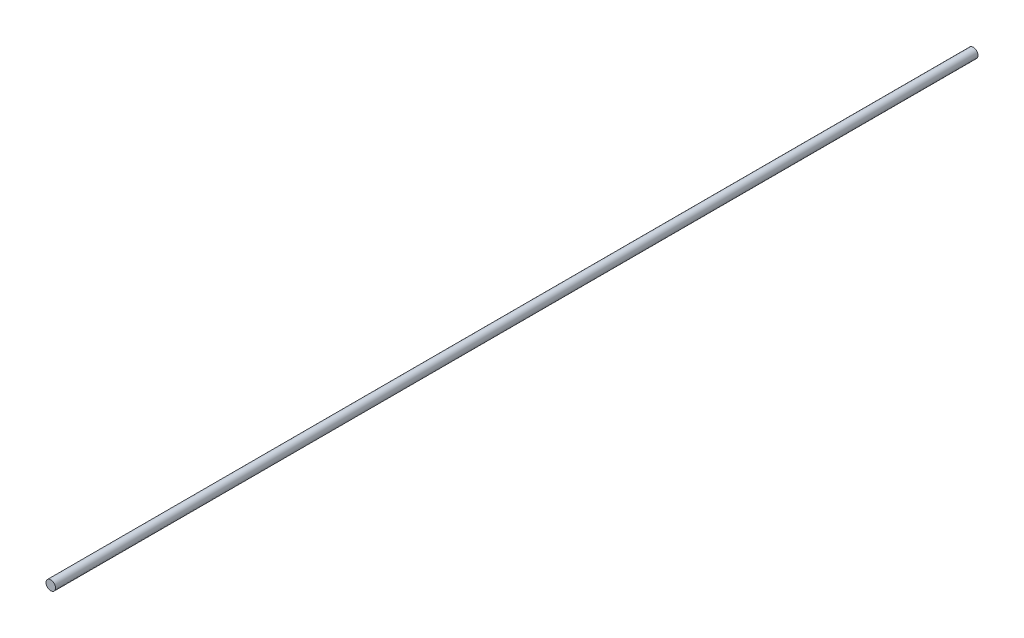
ISO-10303-21;
HEADER;
FILE_DESCRIPTION(('STEP AP214'),'2;1');
FILE_NAME('part.step','',(''),(''),'','','');
FILE_SCHEMA(('AUTOMOTIVE_DESIGN { 1 0 10303 214 1 1 1 1 }'));
ENDSEC;
DATA;
#1=APPLICATION_CONTEXT('core data for automotive mechanical design processes');
#2=APPLICATION_PROTOCOL_DEFINITION('international standard','automotive_design',2000,#1);
#3=PRODUCT_CONTEXT('',#1,'mechanical');
#4=PRODUCT('Part','Part','',(#3));
#5=PRODUCT_RELATED_PRODUCT_CATEGORY('part','',(#4));
#6=PRODUCT_DEFINITION_FORMATION('','',#4);
#7=PRODUCT_DEFINITION_CONTEXT('part definition',#1,'design');
#8=PRODUCT_DEFINITION('design','',#6,#7);
#9=PRODUCT_DEFINITION_SHAPE('','',#8);
#10=(LENGTH_UNIT() NAMED_UNIT(*) SI_UNIT(.MILLI.,.METRE.));
#11=(NAMED_UNIT(*) PLANE_ANGLE_UNIT() SI_UNIT($,.RADIAN.));
#12=(NAMED_UNIT(*) SI_UNIT($,.STERADIAN.) SOLID_ANGLE_UNIT());
#13=UNCERTAINTY_MEASURE_WITH_UNIT(LENGTH_MEASURE(1.E-05),#10,'distance_accuracy_value','');
#14=(GEOMETRIC_REPRESENTATION_CONTEXT(3) GLOBAL_UNCERTAINTY_ASSIGNED_CONTEXT((#13)) GLOBAL_UNIT_ASSIGNED_CONTEXT((#10,
#11,#12)) REPRESENTATION_CONTEXT('',''));
#15=CARTESIAN_POINT('',(0.,0.,0.));
#16=DIRECTION('',(0.,0.,1.));
#17=DIRECTION('',(1.,0.,0.));
#18=AXIS2_PLACEMENT_3D('',#15,#16,#17);
#19=CARTESIAN_POINT('',(0.,0.,1940.));
#20=DIRECTION('',(0.,0.,-1.));
#21=DIRECTION('',(-1.,0.,0.));
#22=AXIS2_PLACEMENT_3D('',#19,#20,#21);
#23=CYLINDRICAL_SURFACE('',#22,10.);
#24=CARTESIAN_POINT('',(0.,0.,1940.));
#25=DIRECTION('',(0.,0.,1.));
#26=DIRECTION('',(1.,0.,0.));
#27=AXIS2_PLACEMENT_3D('',#24,#25,#26);
#28=CIRCLE('',#27,10.);
#29=CARTESIAN_POINT('',(10.,0.,1940.));
#30=VERTEX_POINT('',#29);
#31=EDGE_CURVE('E10',#30,#30,#28,.T.);
#32=ORIENTED_EDGE('',*,*,#31,.F.);
#33=EDGE_LOOP('',(#32));
#34=FACE_BOUND('',#33,.T.);
#35=CARTESIAN_POINT('',(0.,0.,0.));
#36=DIRECTION('',(0.,0.,1.));
#37=DIRECTION('',(1.,0.,0.));
#38=AXIS2_PLACEMENT_3D('',#35,#36,#37);
#39=CIRCLE('',#38,10.);
#40=CARTESIAN_POINT('',(10.,0.,0.));
#41=VERTEX_POINT('',#40);
#42=EDGE_CURVE('E33',#41,#41,#39,.T.);
#43=ORIENTED_EDGE('',*,*,#42,.T.);
#44=EDGE_LOOP('',(#43));
#45=FACE_BOUND('',#44,.T.);
#46=ADVANCED_FACE('F30',(#34,#45),#23,.T.);
#47=CARTESIAN_POINT('',(0.,0.,1940.));
#48=DIRECTION('',(0.,0.,1.));
#49=DIRECTION('',(1.,0.,0.));
#50=AXIS2_PLACEMENT_3D('',#47,#48,#49);
#51=PLANE('',#50);
#52=ORIENTED_EDGE('',*,*,#31,.T.);
#53=EDGE_LOOP('',(#52));
#54=FACE_BOUND('',#53,.T.);
#55=ADVANCED_FACE('F45',(#54),#51,.T.);
#56=CARTESIAN_POINT('',(0.,0.,0.));
#57=DIRECTION('',(0.,0.,1.));
#58=DIRECTION('',(1.,0.,0.));
#59=AXIS2_PLACEMENT_3D('',#56,#57,#58);
#60=PLANE('',#59);
#61=ORIENTED_EDGE('',*,*,#42,.F.);
#62=EDGE_LOOP('',(#61));
#63=FACE_BOUND('',#62,.T.);
#64=ADVANCED_FACE('F43',(#63),#60,.F.);
#65=CLOSED_SHELL('',(#46,#55,#64));
#66=MANIFOLD_SOLID_BREP('B2',#65);
#67=ADVANCED_BREP_SHAPE_REPRESENTATION('',(#18,#66),#14);
#68=SHAPE_DEFINITION_REPRESENTATION(#9,#67);
ENDSEC;
END-ISO-10303-21;
